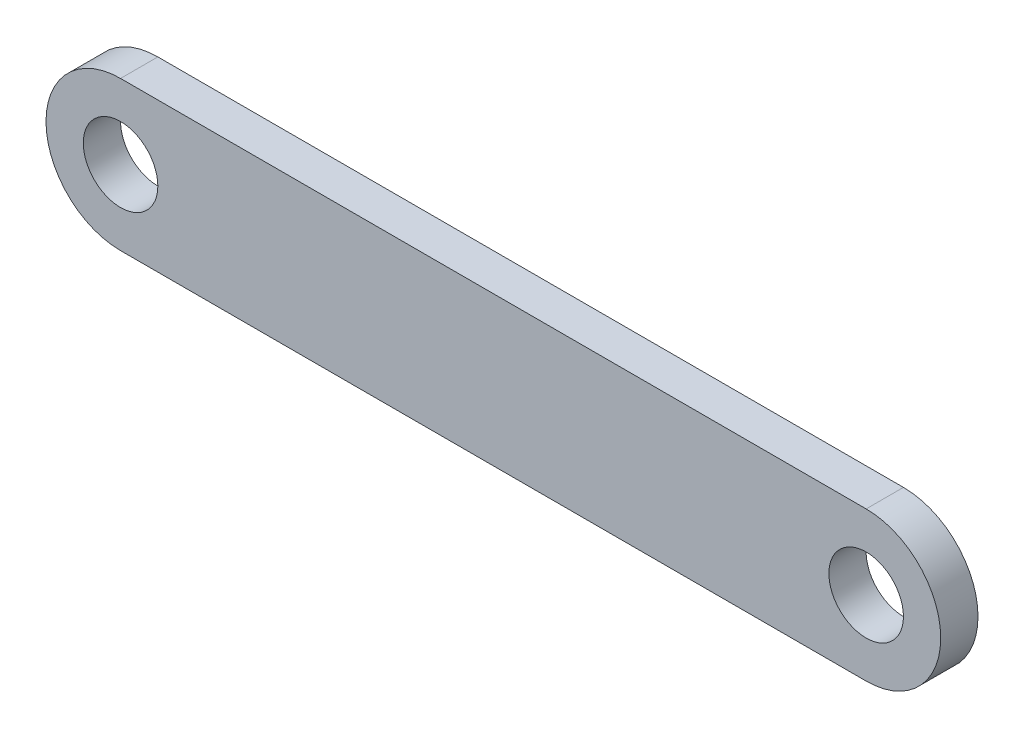
ISO-10303-21;
HEADER;
FILE_DESCRIPTION(('STEP AP214'),'2;1');
FILE_NAME('part.step','',(''),(''),'','','');
FILE_SCHEMA(('AUTOMOTIVE_DESIGN { 1 0 10303 214 1 1 1 1 }'));
ENDSEC;
DATA;
#1=APPLICATION_CONTEXT('core data for automotive mechanical design processes');
#2=APPLICATION_PROTOCOL_DEFINITION('international standard','automotive_design',2000,#1);
#3=PRODUCT_CONTEXT('',#1,'mechanical');
#4=PRODUCT('Part','Part','',(#3));
#5=PRODUCT_RELATED_PRODUCT_CATEGORY('part','',(#4));
#6=PRODUCT_DEFINITION_FORMATION('','',#4);
#7=PRODUCT_DEFINITION_CONTEXT('part definition',#1,'design');
#8=PRODUCT_DEFINITION('design','',#6,#7);
#9=PRODUCT_DEFINITION_SHAPE('','',#8);
#10=(LENGTH_UNIT() NAMED_UNIT(*) SI_UNIT(.MILLI.,.METRE.));
#11=(NAMED_UNIT(*) PLANE_ANGLE_UNIT() SI_UNIT($,.RADIAN.));
#12=(NAMED_UNIT(*) SI_UNIT($,.STERADIAN.) SOLID_ANGLE_UNIT());
#13=UNCERTAINTY_MEASURE_WITH_UNIT(LENGTH_MEASURE(1.E-05),#10,'distance_accuracy_value','');
#14=(GEOMETRIC_REPRESENTATION_CONTEXT(3) GLOBAL_UNCERTAINTY_ASSIGNED_CONTEXT((#13)) GLOBAL_UNIT_ASSIGNED_CONTEXT((#10,
#11,#12)) REPRESENTATION_CONTEXT('',''));
#15=CARTESIAN_POINT('',(0.,0.,0.));
#16=DIRECTION('',(0.,0.,1.));
#17=DIRECTION('',(1.,0.,0.));
#18=AXIS2_PLACEMENT_3D('',#15,#16,#17);
#19=CARTESIAN_POINT('',(-38.6981539199233,2.88659793814433,5.));
#20=DIRECTION('',(0.,0.,1.));
#21=DIRECTION('',(1.,0.,0.));
#22=AXIS2_PLACEMENT_3D('',#19,#20,#21);
#23=PLANE('',#22);
#24=CARTESIAN_POINT('',(-38.6981539199233,2.88659793814433,5.));
#25=DIRECTION('',(0.,0.,1.));
#26=DIRECTION('',(1.,0.,0.));
#27=AXIS2_PLACEMENT_3D('',#24,#25,#26);
#28=CIRCLE('',#27,5.);
#29=CARTESIAN_POINT('',(-33.6981539199233,2.88659793814433,5.));
#30=VERTEX_POINT('',#29);
#31=EDGE_CURVE('E114',#30,#30,#28,.T.);
#32=ORIENTED_EDGE('',*,*,#31,.F.);
#33=EDGE_LOOP('',(#32));
#34=FACE_BOUND('',#33,.T.);
#35=CARTESIAN_POINT('',(-38.6981539199233,2.88659793814433,5.));
#36=DIRECTION('',(0.,0.,1.));
#37=DIRECTION('',(1.,0.,0.));
#38=AXIS2_PLACEMENT_3D('',#35,#36,#37);
#39=CIRCLE('',#38,10.);
#40=CARTESIAN_POINT('',(-38.6981539199233,12.8865979381443,5.));
#41=VERTEX_POINT('',#40);
#42=CARTESIAN_POINT('',(-38.6981539199233,-7.11340206185567,5.));
#43=VERTEX_POINT('',#42);
#44=EDGE_CURVE('E99',#41,#43,#39,.T.);
#45=ORIENTED_EDGE('',*,*,#44,.T.);
#46=DIRECTION('',(1.,0.,0.));
#47=VECTOR('',#46,1.);
#48=CARTESIAN_POINT('',(-38.6981539199233,-7.11340206185567,5.));
#49=LINE('',#48,#47);
#50=CARTESIAN_POINT('',(61.3018460800767,-7.11340206185567,5.));
#51=VERTEX_POINT('',#50);
#52=EDGE_CURVE('E94',#43,#51,#49,.T.);
#53=ORIENTED_EDGE('',*,*,#52,.T.);
#54=CARTESIAN_POINT('',(61.3018460800767,2.88659793814433,5.));
#55=DIRECTION('',(0.,0.,1.));
#56=DIRECTION('',(1.,0.,0.));
#57=AXIS2_PLACEMENT_3D('',#54,#55,#56);
#58=CIRCLE('',#57,10.);
#59=CARTESIAN_POINT('',(61.3018460800767,12.8865979381443,5.));
#60=VERTEX_POINT('',#59);
#61=EDGE_CURVE('E97',#51,#60,#58,.T.);
#62=ORIENTED_EDGE('',*,*,#61,.T.);
#63=DIRECTION('',(-1.,0.,0.));
#64=VECTOR('',#63,1.);
#65=CARTESIAN_POINT('',(-38.6981539199233,12.8865979381443,5.));
#66=LINE('',#65,#64);
#67=EDGE_CURVE('E64',#60,#41,#66,.T.);
#68=ORIENTED_EDGE('',*,*,#67,.T.);
#69=EDGE_LOOP('',(#45,#53,#62,#68));
#70=FACE_BOUND('',#69,.T.);
#71=CARTESIAN_POINT('',(61.3018460800767,2.88659793814433,5.));
#72=DIRECTION('',(0.,0.,1.));
#73=DIRECTION('',(1.,0.,0.));
#74=AXIS2_PLACEMENT_3D('',#71,#72,#73);
#75=CIRCLE('',#74,5.00000000000002);
#76=CARTESIAN_POINT('',(66.3018460800768,2.88659793814433,5.));
#77=VERTEX_POINT('',#76);
#78=EDGE_CURVE('E129',#77,#77,#75,.T.);
#79=ORIENTED_EDGE('',*,*,#78,.F.);
#80=EDGE_LOOP('',(#79));
#81=FACE_BOUND('',#80,.T.);
#82=ADVANCED_FACE('F47',(#34,#70,#81),#23,.T.);
#83=CARTESIAN_POINT('',(-38.6981539199233,2.88659793814433,0.));
#84=DIRECTION('',(0.,0.,1.));
#85=DIRECTION('',(1.,0.,0.));
#86=AXIS2_PLACEMENT_3D('',#83,#84,#85);
#87=PLANE('',#86);
#88=CARTESIAN_POINT('',(-38.6981539199233,2.88659793814433,0.));
#89=DIRECTION('',(0.,0.,1.));
#90=DIRECTION('',(1.,0.,0.));
#91=AXIS2_PLACEMENT_3D('',#88,#89,#90);
#92=CIRCLE('',#91,10.);
#93=CARTESIAN_POINT('',(-38.6981539199233,12.8865979381443,0.));
#94=VERTEX_POINT('',#93);
#95=CARTESIAN_POINT('',(-38.6981539199233,-7.11340206185567,0.));
#96=VERTEX_POINT('',#95);
#97=EDGE_CURVE('E111',#94,#96,#92,.T.);
#98=ORIENTED_EDGE('',*,*,#97,.F.);
#99=DIRECTION('',(-1.,0.,0.));
#100=VECTOR('',#99,1.);
#101=CARTESIAN_POINT('',(-38.6981539199233,12.8865979381443,0.));
#102=LINE('',#101,#100);
#103=CARTESIAN_POINT('',(61.3018460800767,12.8865979381443,0.));
#104=VERTEX_POINT('',#103);
#105=EDGE_CURVE('E87',#104,#94,#102,.T.);
#106=ORIENTED_EDGE('',*,*,#105,.F.);
#107=CARTESIAN_POINT('',(61.3018460800767,2.88659793814433,0.));
#108=DIRECTION('',(0.,0.,1.));
#109=DIRECTION('',(1.,0.,0.));
#110=AXIS2_PLACEMENT_3D('',#107,#108,#109);
#111=CIRCLE('',#110,10.);
#112=CARTESIAN_POINT('',(61.3018460800767,-7.11340206185567,0.));
#113=VERTEX_POINT('',#112);
#114=EDGE_CURVE('E81',#113,#104,#111,.T.);
#115=ORIENTED_EDGE('',*,*,#114,.F.);
#116=DIRECTION('',(1.,0.,0.));
#117=VECTOR('',#116,1.);
#118=CARTESIAN_POINT('',(-38.6981539199233,-7.11340206185567,0.));
#119=LINE('',#118,#117);
#120=EDGE_CURVE('E103',#96,#113,#119,.T.);
#121=ORIENTED_EDGE('',*,*,#120,.F.);
#122=EDGE_LOOP('',(#98,#106,#115,#121));
#123=FACE_BOUND('',#122,.T.);
#124=CARTESIAN_POINT('',(-38.6981539199233,2.88659793814433,0.));
#125=DIRECTION('',(0.,0.,1.));
#126=DIRECTION('',(1.,0.,0.));
#127=AXIS2_PLACEMENT_3D('',#124,#125,#126);
#128=CIRCLE('',#127,5.);
#129=CARTESIAN_POINT('',(-33.6981539199233,2.88659793814433,0.));
#130=VERTEX_POINT('',#129);
#131=EDGE_CURVE('E126',#130,#130,#128,.T.);
#132=ORIENTED_EDGE('',*,*,#131,.T.);
#133=EDGE_LOOP('',(#132));
#134=FACE_BOUND('',#133,.T.);
#135=CARTESIAN_POINT('',(61.3018460800767,2.88659793814433,0.));
#136=DIRECTION('',(0.,0.,1.));
#137=DIRECTION('',(1.,0.,0.));
#138=AXIS2_PLACEMENT_3D('',#135,#136,#137);
#139=CIRCLE('',#138,5.00000000000002);
#140=CARTESIAN_POINT('',(66.3018460800768,2.88659793814433,0.));
#141=VERTEX_POINT('',#140);
#142=EDGE_CURVE('E132',#141,#141,#139,.T.);
#143=ORIENTED_EDGE('',*,*,#142,.T.);
#144=EDGE_LOOP('',(#143));
#145=FACE_BOUND('',#144,.T.);
#146=ADVANCED_FACE('F122',(#123,#134,#145),#87,.F.);
#147=CARTESIAN_POINT('',(-38.6981539199233,2.88659793814433,5.));
#148=DIRECTION('',(0.,0.,-1.));
#149=DIRECTION('',(-1.,0.,0.));
#150=AXIS2_PLACEMENT_3D('',#147,#148,#149);
#151=CYLINDRICAL_SURFACE('',#150,10.);
#152=ORIENTED_EDGE('',*,*,#97,.T.);
#153=DIRECTION('',(0.,0.,-1.));
#154=VECTOR('',#153,1.);
#155=CARTESIAN_POINT('',(-38.6981539199233,-7.11340206185567,5.));
#156=LINE('',#155,#154);
#157=EDGE_CURVE('E11',#43,#96,#156,.T.);
#158=ORIENTED_EDGE('',*,*,#157,.F.);
#159=ORIENTED_EDGE('',*,*,#44,.F.);
#160=DIRECTION('',(0.,0.,-1.));
#161=VECTOR('',#160,1.);
#162=CARTESIAN_POINT('',(-38.6981539199233,12.8865979381443,5.));
#163=LINE('',#162,#161);
#164=EDGE_CURVE('E107',#41,#94,#163,.T.);
#165=ORIENTED_EDGE('',*,*,#164,.T.);
#166=EDGE_LOOP('',(#152,#158,#159,#165));
#167=FACE_BOUND('',#166,.T.);
#168=ADVANCED_FACE('F49',(#167),#151,.T.);
#169=CARTESIAN_POINT('',(-38.6981539199233,-7.11340206185567,5.));
#170=DIRECTION('',(0.,1.,0.));
#171=DIRECTION('',(-1.,0.,0.));
#172=AXIS2_PLACEMENT_3D('',#169,#170,#171);
#173=PLANE('',#172);
#174=ORIENTED_EDGE('',*,*,#120,.T.);
#175=DIRECTION('',(0.,0.,-1.));
#176=VECTOR('',#175,1.);
#177=CARTESIAN_POINT('',(61.3018460800767,-7.11340206185567,5.));
#178=LINE('',#177,#176);
#179=EDGE_CURVE('E56',#51,#113,#178,.T.);
#180=ORIENTED_EDGE('',*,*,#179,.F.);
#181=ORIENTED_EDGE('',*,*,#52,.F.);
#182=ORIENTED_EDGE('',*,*,#157,.T.);
#183=EDGE_LOOP('',(#174,#180,#181,#182));
#184=FACE_BOUND('',#183,.T.);
#185=ADVANCED_FACE('F102',(#184),#173,.F.);
#186=CARTESIAN_POINT('',(61.3018460800767,2.88659793814433,5.));
#187=DIRECTION('',(0.,0.,-1.));
#188=DIRECTION('',(-1.,0.,0.));
#189=AXIS2_PLACEMENT_3D('',#186,#187,#188);
#190=CYLINDRICAL_SURFACE('',#189,10.);
#191=ORIENTED_EDGE('',*,*,#114,.T.);
#192=DIRECTION('',(0.,0.,-1.));
#193=VECTOR('',#192,1.);
#194=CARTESIAN_POINT('',(61.3018460800767,12.8865979381443,5.));
#195=LINE('',#194,#193);
#196=EDGE_CURVE('E104',#60,#104,#195,.T.);
#197=ORIENTED_EDGE('',*,*,#196,.F.);
#198=ORIENTED_EDGE('',*,*,#61,.F.);
#199=ORIENTED_EDGE('',*,*,#179,.T.);
#200=EDGE_LOOP('',(#191,#197,#198,#199));
#201=FACE_BOUND('',#200,.T.);
#202=ADVANCED_FACE('F105',(#201),#190,.T.);
#203=CARTESIAN_POINT('',(-38.6981539199233,12.8865979381443,5.));
#204=DIRECTION('',(0.,-1.,0.));
#205=DIRECTION('',(0.,0.,-1.));
#206=AXIS2_PLACEMENT_3D('',#203,#204,#205);
#207=PLANE('',#206);
#208=ORIENTED_EDGE('',*,*,#105,.T.);
#209=ORIENTED_EDGE('',*,*,#164,.F.);
#210=ORIENTED_EDGE('',*,*,#67,.F.);
#211=ORIENTED_EDGE('',*,*,#196,.T.);
#212=EDGE_LOOP('',(#208,#209,#210,#211));
#213=FACE_BOUND('',#212,.T.);
#214=ADVANCED_FACE('F119',(#213),#207,.F.);
#215=CARTESIAN_POINT('',(-38.6981539199233,2.88659793814433,5.));
#216=DIRECTION('',(0.,0.,-1.));
#217=DIRECTION('',(-1.,0.,0.));
#218=AXIS2_PLACEMENT_3D('',#215,#216,#217);
#219=CYLINDRICAL_SURFACE('',#218,5.);
#220=ORIENTED_EDGE('',*,*,#31,.T.);
#221=EDGE_LOOP('',(#220));
#222=FACE_BOUND('',#221,.T.);
#223=ORIENTED_EDGE('',*,*,#131,.F.);
#224=EDGE_LOOP('',(#223));
#225=FACE_BOUND('',#224,.T.);
#226=ADVANCED_FACE('F149',(#222,#225),#219,.F.);
#227=CARTESIAN_POINT('',(61.3018460800767,2.88659793814433,5.));
#228=DIRECTION('',(0.,0.,-1.));
#229=DIRECTION('',(-1.,0.,0.));
#230=AXIS2_PLACEMENT_3D('',#227,#228,#229);
#231=CYLINDRICAL_SURFACE('',#230,5.00000000000002);
#232=ORIENTED_EDGE('',*,*,#78,.T.);
#233=EDGE_LOOP('',(#232));
#234=FACE_BOUND('',#233,.T.);
#235=ORIENTED_EDGE('',*,*,#142,.F.);
#236=EDGE_LOOP('',(#235));
#237=FACE_BOUND('',#236,.T.);
#238=ADVANCED_FACE('F138',(#234,#237),#231,.F.);
#239=CLOSED_SHELL('',(#82,#146,#168,#185,#202,#214,#226,#238));
#240=MANIFOLD_SOLID_BREP('B2',#239);
#241=ADVANCED_BREP_SHAPE_REPRESENTATION('',(#18,#240),#14);
#242=SHAPE_DEFINITION_REPRESENTATION(#9,#241);
ENDSEC;
END-ISO-10303-21;
